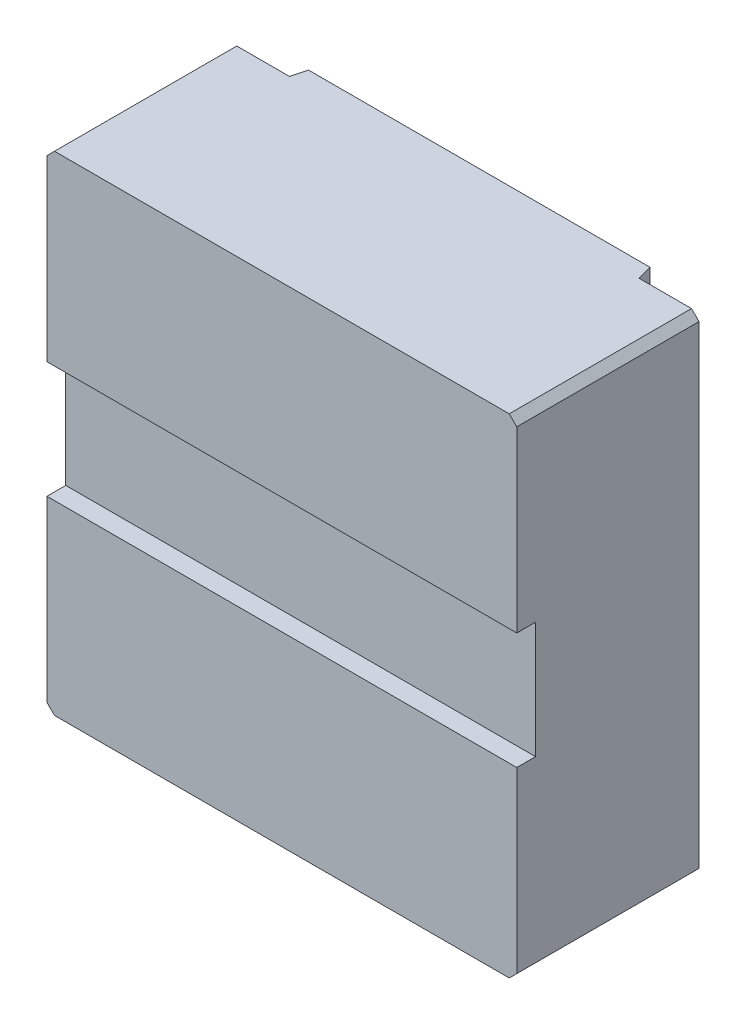
ISO-10303-21;
HEADER;
FILE_DESCRIPTION(('STEP AP214'),'2;1');
FILE_NAME('part.step','',(''),(''),'','','');
FILE_SCHEMA(('AUTOMOTIVE_DESIGN { 1 0 10303 214 1 1 1 1 }'));
ENDSEC;
DATA;
#1=APPLICATION_CONTEXT('core data for automotive mechanical design processes');
#2=APPLICATION_PROTOCOL_DEFINITION('international standard','automotive_design',2000,#1);
#3=PRODUCT_CONTEXT('',#1,'mechanical');
#4=PRODUCT('Part','Part','',(#3));
#5=PRODUCT_RELATED_PRODUCT_CATEGORY('part','',(#4));
#6=PRODUCT_DEFINITION_FORMATION('','',#4);
#7=PRODUCT_DEFINITION_CONTEXT('part definition',#1,'design');
#8=PRODUCT_DEFINITION('design','',#6,#7);
#9=PRODUCT_DEFINITION_SHAPE('','',#8);
#10=(LENGTH_UNIT() NAMED_UNIT(*) SI_UNIT(.MILLI.,.METRE.));
#11=(NAMED_UNIT(*) PLANE_ANGLE_UNIT() SI_UNIT($,.RADIAN.));
#12=(NAMED_UNIT(*) SI_UNIT($,.STERADIAN.) SOLID_ANGLE_UNIT());
#13=UNCERTAINTY_MEASURE_WITH_UNIT(LENGTH_MEASURE(1.E-05),#10,'distance_accuracy_value','');
#14=(GEOMETRIC_REPRESENTATION_CONTEXT(3) GLOBAL_UNCERTAINTY_ASSIGNED_CONTEXT((#13)) GLOBAL_UNIT_ASSIGNED_CONTEXT((#10,
#11,#12)) REPRESENTATION_CONTEXT('',''));
#15=CARTESIAN_POINT('',(0.,0.,0.));
#16=DIRECTION('',(0.,0.,1.));
#17=DIRECTION('',(1.,0.,0.));
#18=AXIS2_PLACEMENT_3D('',#15,#16,#17);
#19=CARTESIAN_POINT('',(-6.25,-6.5,-5.25));
#20=DIRECTION('',(0.,0.,1.));
#21=DIRECTION('',(1.,0.,0.));
#22=AXIS2_PLACEMENT_3D('',#19,#20,#21);
#23=PLANE('',#22);
#24=DIRECTION('',(-1.,0.,0.));
#25=VECTOR('',#24,1.);
#26=CARTESIAN_POINT('',(6.25,6.5,-5.25));
#27=LINE('',#26,#25);
#28=CARTESIAN_POINT('',(4.542820323028,6.5,-5.25));
#29=VERTEX_POINT('',#28);
#30=CARTESIAN_POINT('',(-4.542820323028,6.5,-5.25));
#31=VERTEX_POINT('',#30);
#32=EDGE_CURVE('E11',#29,#31,#27,.T.);
#33=ORIENTED_EDGE('',*,*,#32,.F.);
#34=DIRECTION('',(0.,1.,0.));
#35=VECTOR('',#34,1.);
#36=CARTESIAN_POINT('',(4.542820323028,-18.78330375626,-5.25));
#37=LINE('',#36,#35);
#38=CARTESIAN_POINT('',(4.542820323028,-6.5,-5.25));
#39=VERTEX_POINT('',#38);
#40=EDGE_CURVE('E23',#39,#29,#37,.T.);
#41=ORIENTED_EDGE('',*,*,#40,.F.);
#42=DIRECTION('',(1.,0.,0.));
#43=VECTOR('',#42,1.);
#44=CARTESIAN_POINT('',(-6.25,-6.5,-5.25));
#45=LINE('',#44,#43);
#46=CARTESIAN_POINT('',(-4.542820323028,-6.5,-5.25));
#47=VERTEX_POINT('',#46);
#48=EDGE_CURVE('E257',#47,#39,#45,.T.);
#49=ORIENTED_EDGE('',*,*,#48,.F.);
#50=DIRECTION('',(0.,-1.,0.));
#51=VECTOR('',#50,1.);
#52=CARTESIAN_POINT('',(-4.542820323028,-6.5,-5.25));
#53=LINE('',#52,#51);
#54=EDGE_CURVE('E36',#31,#47,#53,.T.);
#55=ORIENTED_EDGE('',*,*,#54,.F.);
#56=EDGE_LOOP('',(#33,#41,#49,#55));
#57=FACE_BOUND('',#56,.T.);
#58=ADVANCED_FACE('F16',(#57),#23,.F.);
#59=CARTESIAN_POINT('',(-6.25,-6.3,-5.25));
#60=DIRECTION('',(0.707106781186548,0.707106781186548,0.));
#61=DIRECTION('',(-0.707106781186548,0.707106781186548,0.));
#62=AXIS2_PLACEMENT_3D('',#59,#60,#61);
#63=PLANE('',#62);
#64=DIRECTION('',(0.707106781186548,-0.707106781186548,0.));
#65=VECTOR('',#64,1.);
#66=CARTESIAN_POINT('',(0.791651878131,-13.34165187813,-4.85));
#67=LINE('',#66,#65);
#68=CARTESIAN_POINT('',(-6.25,-6.3,-4.85));
#69=VERTEX_POINT('',#68);
#70=CARTESIAN_POINT('',(-6.05,-6.5,-4.85));
#71=VERTEX_POINT('',#70);
#72=EDGE_CURVE('E254',#69,#71,#67,.T.);
#73=ORIENTED_EDGE('',*,*,#72,.T.);
#74=DIRECTION('',(0.,0.,-1.));
#75=VECTOR('',#74,1.);
#76=CARTESIAN_POINT('',(-6.05,-6.5,-5.25));
#77=LINE('',#76,#75);
#78=CARTESIAN_POINT('',(-6.05,-6.5,0.));
#79=VERTEX_POINT('',#78);
#80=EDGE_CURVE('E134',#79,#71,#77,.T.);
#81=ORIENTED_EDGE('',*,*,#80,.F.);
#82=DIRECTION('',(-0.707106781186548,0.707106781186548,0.));
#83=VECTOR('',#82,1.);
#84=CARTESIAN_POINT('',(-6.15,-6.4,0.));
#85=LINE('',#84,#83);
#86=CARTESIAN_POINT('',(-6.25,-6.3,0.));
#87=VERTEX_POINT('',#86);
#88=EDGE_CURVE('E250',#79,#87,#85,.T.);
#89=ORIENTED_EDGE('',*,*,#88,.T.);
#90=DIRECTION('',(0.,0.,1.));
#91=VECTOR('',#90,1.);
#92=CARTESIAN_POINT('',(-6.25,-6.3,-5.25));
#93=LINE('',#92,#91);
#94=EDGE_CURVE('E248',#69,#87,#93,.T.);
#95=ORIENTED_EDGE('',*,*,#94,.F.);
#96=EDGE_LOOP('',(#73,#81,#89,#95));
#97=FACE_BOUND('',#96,.T.);
#98=ADVANCED_FACE('F300',(#97),#63,.F.);
#99=CARTESIAN_POINT('',(6.25,6.5,-5.25));
#100=DIRECTION('',(0.,1.,0.));
#101=DIRECTION('',(-1.,0.,0.));
#102=AXIS2_PLACEMENT_3D('',#99,#100,#101);
#103=PLANE('',#102);
#104=DIRECTION('',(-1.,0.,0.));
#105=VECTOR('',#104,1.);
#106=CARTESIAN_POINT('',(6.25,6.5,0.));
#107=LINE('',#106,#105);
#108=CARTESIAN_POINT('',(6.05,6.5,0.));
#109=VERTEX_POINT('',#108);
#110=CARTESIAN_POINT('',(-6.05,6.5,0.));
#111=VERTEX_POINT('',#110);
#112=EDGE_CURVE('E246',#109,#111,#107,.T.);
#113=ORIENTED_EDGE('',*,*,#112,.F.);
#114=DIRECTION('',(0.,0.,-1.));
#115=VECTOR('',#114,1.);
#116=CARTESIAN_POINT('',(6.05,6.5,-5.25));
#117=LINE('',#116,#115);
#118=CARTESIAN_POINT('',(6.05,6.5,-4.85));
#119=VERTEX_POINT('',#118);
#120=EDGE_CURVE('E244',#109,#119,#117,.T.);
#121=ORIENTED_EDGE('',*,*,#120,.T.);
#122=DIRECTION('',(-1.,0.,0.));
#123=VECTOR('',#122,1.);
#124=CARTESIAN_POINT('',(6.25,6.5,-4.85));
#125=LINE('',#124,#123);
#126=CARTESIAN_POINT('',(4.65,6.5,-4.85));
#127=VERTEX_POINT('',#126);
#128=EDGE_CURVE('E242',#119,#127,#125,.T.);
#129=ORIENTED_EDGE('',*,*,#128,.T.);
#130=DIRECTION('',(-0.258819045102985,0.,-0.965925826288944));
#131=VECTOR('',#130,1.);
#132=CARTESIAN_POINT('',(4.657179676972,6.5,-4.823205080757));
#133=LINE('',#132,#131);
#134=EDGE_CURVE('E239',#127,#29,#133,.T.);
#135=ORIENTED_EDGE('',*,*,#134,.T.);
#136=ORIENTED_EDGE('',*,*,#32,.T.);
#137=DIRECTION('',(0.258819045102985,0.,-0.965925826288944));
#138=VECTOR('',#137,1.);
#139=CARTESIAN_POINT('',(-3.819838450625,6.5,-7.948205080757));
#140=LINE('',#139,#138);
#141=CARTESIAN_POINT('',(-4.65,6.5,-4.85));
#142=VERTEX_POINT('',#141);
#143=EDGE_CURVE('E237',#142,#31,#140,.T.);
#144=ORIENTED_EDGE('',*,*,#143,.F.);
#145=DIRECTION('',(1.,0.,0.));
#146=VECTOR('',#145,1.);
#147=CARTESIAN_POINT('',(6.25,6.5,-4.85));
#148=LINE('',#147,#146);
#149=CARTESIAN_POINT('',(-6.05,6.5,-4.85));
#150=VERTEX_POINT('',#149);
#151=EDGE_CURVE('E152',#150,#142,#148,.T.);
#152=ORIENTED_EDGE('',*,*,#151,.F.);
#153=DIRECTION('',(0.,0.,1.));
#154=VECTOR('',#153,1.);
#155=CARTESIAN_POINT('',(-6.05,6.5,-5.25));
#156=LINE('',#155,#154);
#157=EDGE_CURVE('E233',#150,#111,#156,.T.);
#158=ORIENTED_EDGE('',*,*,#157,.T.);
#159=EDGE_LOOP('',(#113,#121,#129,#135,#136,#144,#152,#158));
#160=FACE_BOUND('',#159,.T.);
#161=ADVANCED_FACE('F302',(#160),#103,.T.);
#162=CARTESIAN_POINT('',(4.65,-18.78330375626,-4.85));
#163=DIRECTION('',(0.,0.,1.));
#164=DIRECTION('',(1.,0.,0.));
#165=AXIS2_PLACEMENT_3D('',#162,#163,#164);
#166=PLANE('',#165);
#167=DIRECTION('',(0.,-1.,0.));
#168=VECTOR('',#167,1.);
#169=CARTESIAN_POINT('',(6.25,-6.5,-4.85));
#170=LINE('',#169,#168);
#171=CARTESIAN_POINT('',(6.25,6.3,-4.85));
#172=VERTEX_POINT('',#171);
#173=CARTESIAN_POINT('',(6.25,-6.3,-4.85));
#174=VERTEX_POINT('',#173);
#175=EDGE_CURVE('E230',#172,#174,#170,.T.);
#176=ORIENTED_EDGE('',*,*,#175,.T.);
#177=DIRECTION('',(0.707106781186548,0.707106781186548,0.));
#178=VECTOR('',#177,1.);
#179=CARTESIAN_POINT('',(6.05,-6.5,-4.85));
#180=LINE('',#179,#178);
#181=CARTESIAN_POINT('',(6.05,-6.5,-4.85));
#182=VERTEX_POINT('',#181);
#183=EDGE_CURVE('E228',#182,#174,#180,.T.);
#184=ORIENTED_EDGE('',*,*,#183,.F.);
#185=DIRECTION('',(-1.,0.,0.));
#186=VECTOR('',#185,1.);
#187=CARTESIAN_POINT('',(-6.25,-6.5,-4.85));
#188=LINE('',#187,#186);
#189=CARTESIAN_POINT('',(4.65,-6.5,-4.85));
#190=VERTEX_POINT('',#189);
#191=EDGE_CURVE('E225',#182,#190,#188,.T.);
#192=ORIENTED_EDGE('',*,*,#191,.T.);
#193=DIRECTION('',(0.,1.,0.));
#194=VECTOR('',#193,1.);
#195=CARTESIAN_POINT('',(4.65,-18.78330375626,-4.85));
#196=LINE('',#195,#194);
#197=EDGE_CURVE('E222',#190,#127,#196,.T.);
#198=ORIENTED_EDGE('',*,*,#197,.T.);
#199=ORIENTED_EDGE('',*,*,#128,.F.);
#200=DIRECTION('',(-0.707106781186548,0.707106781186548,0.));
#201=VECTOR('',#200,1.);
#202=CARTESIAN_POINT('',(6.25,6.3,-4.85));
#203=LINE('',#202,#201);
#204=EDGE_CURVE('E219',#172,#119,#203,.T.);
#205=ORIENTED_EDGE('',*,*,#204,.F.);
#206=EDGE_LOOP('',(#176,#184,#192,#198,#199,#205));
#207=FACE_BOUND('',#206,.T.);
#208=ADVANCED_FACE('F263',(#207),#166,.F.);
#209=CARTESIAN_POINT('',(4.542820323028,-18.78330375626,-5.25));
#210=DIRECTION('',(-0.965925826288944,0.,0.258819045102985));
#211=DIRECTION('',(0.258819045102985,0.,0.965925826288944));
#212=AXIS2_PLACEMENT_3D('',#209,#210,#211);
#213=PLANE('',#212);
#214=DIRECTION('',(-0.258819045102985,0.,-0.965925826288944));
#215=VECTOR('',#214,1.);
#216=CARTESIAN_POINT('',(3.819838450625,-6.5,-7.948205080757));
#217=LINE('',#216,#215);
#218=EDGE_CURVE('E217',#190,#39,#217,.T.);
#219=ORIENTED_EDGE('',*,*,#218,.T.);
#220=ORIENTED_EDGE('',*,*,#40,.T.);
#221=ORIENTED_EDGE('',*,*,#134,.F.);
#222=ORIENTED_EDGE('',*,*,#197,.F.);
#223=EDGE_LOOP('',(#219,#220,#221,#222));
#224=FACE_BOUND('',#223,.T.);
#225=ADVANCED_FACE('F259',(#224),#213,.F.);
#226=CARTESIAN_POINT('',(-6.25,6.5,-5.25));
#227=DIRECTION('',(-1.,0.,0.));
#228=DIRECTION('',(0.,0.,1.));
#229=AXIS2_PLACEMENT_3D('',#226,#227,#228);
#230=PLANE('',#229);
#231=DIRECTION('',(0.,-1.,0.));
#232=VECTOR('',#231,1.);
#233=CARTESIAN_POINT('',(-6.25,6.5,0.));
#234=LINE('',#233,#232);
#235=CARTESIAN_POINT('',(-6.25,6.3,0.));
#236=VERTEX_POINT('',#235);
#237=CARTESIAN_POINT('',(-6.25,1.55,0.));
#238=VERTEX_POINT('',#237);
#239=EDGE_CURVE('E215',#236,#238,#234,.T.);
#240=ORIENTED_EDGE('',*,*,#239,.F.);
#241=DIRECTION('',(0.,0.,-1.));
#242=VECTOR('',#241,1.);
#243=CARTESIAN_POINT('',(-6.25,6.3,-5.25));
#244=LINE('',#243,#242);
#245=CARTESIAN_POINT('',(-6.25,6.3,-4.85));
#246=VERTEX_POINT('',#245);
#247=EDGE_CURVE('E213',#236,#246,#244,.T.);
#248=ORIENTED_EDGE('',*,*,#247,.T.);
#249=DIRECTION('',(0.,1.,0.));
#250=VECTOR('',#249,1.);
#251=CARTESIAN_POINT('',(-6.25,-18.78330375626,-4.85));
#252=LINE('',#251,#250);
#253=EDGE_CURVE('E211',#69,#246,#252,.T.);
#254=ORIENTED_EDGE('',*,*,#253,.F.);
#255=ORIENTED_EDGE('',*,*,#94,.T.);
#256=DIRECTION('',(0.,-1.,0.));
#257=VECTOR('',#256,1.);
#258=CARTESIAN_POINT('',(-6.25,6.5,0.));
#259=LINE('',#258,#257);
#260=CARTESIAN_POINT('',(-6.25,-1.55,0.));
#261=VERTEX_POINT('',#260);
#262=EDGE_CURVE('E208',#261,#87,#259,.T.);
#263=ORIENTED_EDGE('',*,*,#262,.F.);
#264=DIRECTION('',(0.,0.,-1.));
#265=VECTOR('',#264,1.);
#266=CARTESIAN_POINT('',(-6.25,-1.55,0.));
#267=LINE('',#266,#265);
#268=CARTESIAN_POINT('',(-6.25,-1.55,-0.5));
#269=VERTEX_POINT('',#268);
#270=EDGE_CURVE('E206',#261,#269,#267,.T.);
#271=ORIENTED_EDGE('',*,*,#270,.T.);
#272=DIRECTION('',(0.,1.,0.));
#273=VECTOR('',#272,1.);
#274=CARTESIAN_POINT('',(-6.25,-1.55,-0.5));
#275=LINE('',#274,#273);
#276=CARTESIAN_POINT('',(-6.25,1.55,-0.5));
#277=VERTEX_POINT('',#276);
#278=EDGE_CURVE('E204',#269,#277,#275,.T.);
#279=ORIENTED_EDGE('',*,*,#278,.T.);
#280=DIRECTION('',(0.,0.,-1.));
#281=VECTOR('',#280,1.);
#282=CARTESIAN_POINT('',(-6.25,1.55,0.));
#283=LINE('',#282,#281);
#284=EDGE_CURVE('E201',#238,#277,#283,.T.);
#285=ORIENTED_EDGE('',*,*,#284,.F.);
#286=EDGE_LOOP('',(#240,#248,#254,#255,#263,#271,#279,#285));
#287=FACE_BOUND('',#286,.T.);
#288=ADVANCED_FACE('F286',(#287),#230,.T.);
#289=CARTESIAN_POINT('',(-6.25,-6.5,0.));
#290=DIRECTION('',(0.,0.,1.));
#291=DIRECTION('',(1.,0.,0.));
#292=AXIS2_PLACEMENT_3D('',#289,#290,#291);
#293=PLANE('',#292);
#294=DIRECTION('',(1.,0.,0.));
#295=VECTOR('',#294,1.);
#296=CARTESIAN_POINT('',(-6.25,-6.5,0.));
#297=LINE('',#296,#295);
#298=CARTESIAN_POINT('',(6.05,-6.5,0.));
#299=VERTEX_POINT('',#298);
#300=EDGE_CURVE('E199',#79,#299,#297,.T.);
#301=ORIENTED_EDGE('',*,*,#300,.T.);
#302=DIRECTION('',(-0.707106781186548,-0.707106781186548,0.));
#303=VECTOR('',#302,1.);
#304=CARTESIAN_POINT('',(-0.09999999999997,-12.65,0.));
#305=LINE('',#304,#303);
#306=CARTESIAN_POINT('',(6.25,-6.3,0.));
#307=VERTEX_POINT('',#306);
#308=EDGE_CURVE('E196',#307,#299,#305,.T.);
#309=ORIENTED_EDGE('',*,*,#308,.F.);
#310=DIRECTION('',(0.,1.,0.));
#311=VECTOR('',#310,1.);
#312=CARTESIAN_POINT('',(6.25,-6.5,0.));
#313=LINE('',#312,#311);
#314=CARTESIAN_POINT('',(6.25,-1.55,0.));
#315=VERTEX_POINT('',#314);
#316=EDGE_CURVE('E194',#307,#315,#313,.T.);
#317=ORIENTED_EDGE('',*,*,#316,.T.);
#318=DIRECTION('',(-1.,0.,0.));
#319=VECTOR('',#318,1.);
#320=CARTESIAN_POINT('',(6.25,-1.55,0.));
#321=LINE('',#320,#319);
#322=EDGE_CURVE('E191',#315,#261,#321,.T.);
#323=ORIENTED_EDGE('',*,*,#322,.T.);
#324=ORIENTED_EDGE('',*,*,#262,.T.);
#325=ORIENTED_EDGE('',*,*,#88,.F.);
#326=EDGE_LOOP('',(#301,#309,#317,#323,#324,#325));
#327=FACE_BOUND('',#326,.T.);
#328=ADVANCED_FACE('F270',(#327),#293,.T.);
#329=CARTESIAN_POINT('',(-6.25,-6.5,0.));
#330=DIRECTION('',(0.,0.,1.));
#331=DIRECTION('',(1.,0.,0.));
#332=AXIS2_PLACEMENT_3D('',#329,#330,#331);
#333=PLANE('',#332);
#334=DIRECTION('',(0.,1.,0.));
#335=VECTOR('',#334,1.);
#336=CARTESIAN_POINT('',(6.25,-6.5,0.));
#337=LINE('',#336,#335);
#338=CARTESIAN_POINT('',(6.25,1.55,0.));
#339=VERTEX_POINT('',#338);
#340=CARTESIAN_POINT('',(6.25,6.3,0.));
#341=VERTEX_POINT('',#340);
#342=EDGE_CURVE('E189',#339,#341,#337,.T.);
#343=ORIENTED_EDGE('',*,*,#342,.T.);
#344=DIRECTION('',(0.707106781186548,-0.707106781186548,0.));
#345=VECTOR('',#344,1.);
#346=CARTESIAN_POINT('',(6.4,6.15,0.));
#347=LINE('',#346,#345);
#348=EDGE_CURVE('E186',#109,#341,#347,.T.);
#349=ORIENTED_EDGE('',*,*,#348,.F.);
#350=ORIENTED_EDGE('',*,*,#112,.T.);
#351=DIRECTION('',(0.707106781186548,0.707106781186548,0.));
#352=VECTOR('',#351,1.);
#353=CARTESIAN_POINT('',(-12.65,-0.1,0.));
#354=LINE('',#353,#352);
#355=EDGE_CURVE('E183',#236,#111,#354,.T.);
#356=ORIENTED_EDGE('',*,*,#355,.F.);
#357=ORIENTED_EDGE('',*,*,#239,.T.);
#358=DIRECTION('',(-1.,0.,0.));
#359=VECTOR('',#358,1.);
#360=CARTESIAN_POINT('',(6.25,1.55,0.));
#361=LINE('',#360,#359);
#362=EDGE_CURVE('E180',#339,#238,#361,.T.);
#363=ORIENTED_EDGE('',*,*,#362,.F.);
#364=EDGE_LOOP('',(#343,#349,#350,#356,#357,#363));
#365=FACE_BOUND('',#364,.T.);
#366=ADVANCED_FACE('F291',(#365),#333,.T.);
#367=CARTESIAN_POINT('',(6.25,-6.5,-5.25));
#368=DIRECTION('',(1.,0.,0.));
#369=DIRECTION('',(0.,0.,-1.));
#370=AXIS2_PLACEMENT_3D('',#367,#368,#369);
#371=PLANE('',#370);
#372=ORIENTED_EDGE('',*,*,#316,.F.);
#373=DIRECTION('',(0.,0.,-1.));
#374=VECTOR('',#373,1.);
#375=CARTESIAN_POINT('',(6.25,-6.3,-5.25));
#376=LINE('',#375,#374);
#377=EDGE_CURVE('E177',#307,#174,#376,.T.);
#378=ORIENTED_EDGE('',*,*,#377,.T.);
#379=ORIENTED_EDGE('',*,*,#175,.F.);
#380=DIRECTION('',(0.,0.,1.));
#381=VECTOR('',#380,1.);
#382=CARTESIAN_POINT('',(6.25,6.3,-5.25));
#383=LINE('',#382,#381);
#384=EDGE_CURVE('E174',#172,#341,#383,.T.);
#385=ORIENTED_EDGE('',*,*,#384,.T.);
#386=ORIENTED_EDGE('',*,*,#342,.F.);
#387=DIRECTION('',(0.,0.,1.));
#388=VECTOR('',#387,1.);
#389=CARTESIAN_POINT('',(6.25,1.55,-0.5));
#390=LINE('',#389,#388);
#391=CARTESIAN_POINT('',(6.25,1.55,-0.5));
#392=VERTEX_POINT('',#391);
#393=EDGE_CURVE('E171',#392,#339,#390,.T.);
#394=ORIENTED_EDGE('',*,*,#393,.F.);
#395=DIRECTION('',(0.,1.,0.));
#396=VECTOR('',#395,1.);
#397=CARTESIAN_POINT('',(6.25,-1.55,-0.5));
#398=LINE('',#397,#396);
#399=CARTESIAN_POINT('',(6.25,-1.55,-0.5));
#400=VERTEX_POINT('',#399);
#401=EDGE_CURVE('E168',#400,#392,#398,.T.);
#402=ORIENTED_EDGE('',*,*,#401,.F.);
#403=DIRECTION('',(0.,0.,1.));
#404=VECTOR('',#403,1.);
#405=CARTESIAN_POINT('',(6.25,-1.55,-0.5));
#406=LINE('',#405,#404);
#407=EDGE_CURVE('E165',#400,#315,#406,.T.);
#408=ORIENTED_EDGE('',*,*,#407,.T.);
#409=EDGE_LOOP('',(#372,#378,#379,#385,#386,#394,#402,#408));
#410=FACE_BOUND('',#409,.T.);
#411=ADVANCED_FACE('F273',(#410),#371,.T.);
#412=CARTESIAN_POINT('',(6.25,6.3,-5.25));
#413=DIRECTION('',(-0.707106781186548,-0.707106781186548,0.));
#414=DIRECTION('',(0.707106781186548,-0.707106781186548,0.));
#415=AXIS2_PLACEMENT_3D('',#412,#413,#414);
#416=PLANE('',#415);
#417=ORIENTED_EDGE('',*,*,#204,.T.);
#418=ORIENTED_EDGE('',*,*,#120,.F.);
#419=ORIENTED_EDGE('',*,*,#348,.T.);
#420=ORIENTED_EDGE('',*,*,#384,.F.);
#421=EDGE_LOOP('',(#417,#418,#419,#420));
#422=FACE_BOUND('',#421,.T.);
#423=ADVANCED_FACE('F323',(#422),#416,.F.);
#424=CARTESIAN_POINT('',(6.05,-6.5,-5.25));
#425=DIRECTION('',(-0.707106781186548,0.707106781186548,0.));
#426=DIRECTION('',(-0.707106781186548,-0.707106781186548,0.));
#427=AXIS2_PLACEMENT_3D('',#424,#425,#426);
#428=PLANE('',#427);
#429=ORIENTED_EDGE('',*,*,#183,.T.);
#430=ORIENTED_EDGE('',*,*,#377,.F.);
#431=ORIENTED_EDGE('',*,*,#308,.T.);
#432=DIRECTION('',(0.,0.,1.));
#433=VECTOR('',#432,1.);
#434=CARTESIAN_POINT('',(6.05,-6.5,-5.25));
#435=LINE('',#434,#433);
#436=EDGE_CURVE('E139',#182,#299,#435,.T.);
#437=ORIENTED_EDGE('',*,*,#436,.F.);
#438=EDGE_LOOP('',(#429,#430,#431,#437));
#439=FACE_BOUND('',#438,.T.);
#440=ADVANCED_FACE('F266',(#439),#428,.F.);
#441=CARTESIAN_POINT('',(-6.25,-6.5,-5.25));
#442=DIRECTION('',(0.,-1.,0.));
#443=DIRECTION('',(1.,0.,0.));
#444=AXIS2_PLACEMENT_3D('',#441,#442,#443);
#445=PLANE('',#444);
#446=ORIENTED_EDGE('',*,*,#191,.F.);
#447=ORIENTED_EDGE('',*,*,#436,.T.);
#448=ORIENTED_EDGE('',*,*,#300,.F.);
#449=ORIENTED_EDGE('',*,*,#80,.T.);
#450=DIRECTION('',(1.,0.,0.));
#451=VECTOR('',#450,1.);
#452=CARTESIAN_POINT('',(-6.25,-6.5,-4.85));
#453=LINE('',#452,#451);
#454=CARTESIAN_POINT('',(-4.65,-6.5,-4.85));
#455=VERTEX_POINT('',#454);
#456=EDGE_CURVE('E128',#71,#455,#453,.T.);
#457=ORIENTED_EDGE('',*,*,#456,.T.);
#458=DIRECTION('',(0.258819045102985,0.,-0.965925826288944));
#459=VECTOR('',#458,1.);
#460=CARTESIAN_POINT('',(-4.657179676972,-6.5,-4.823205080757));
#461=LINE('',#460,#459);
#462=EDGE_CURVE('E131',#455,#47,#461,.T.);
#463=ORIENTED_EDGE('',*,*,#462,.T.);
#464=ORIENTED_EDGE('',*,*,#48,.T.);
#465=ORIENTED_EDGE('',*,*,#218,.F.);
#466=EDGE_LOOP('',(#446,#447,#448,#449,#457,#463,#464,#465));
#467=FACE_BOUND('',#466,.T.);
#468=ADVANCED_FACE('F130',(#467),#445,.T.);
#469=CARTESIAN_POINT('',(-6.25,-1.55,-0.5));
#470=DIRECTION('',(0.,-1.,0.));
#471=DIRECTION('',(0.,0.,-1.));
#472=AXIS2_PLACEMENT_3D('',#469,#470,#471);
#473=PLANE('',#472);
#474=ORIENTED_EDGE('',*,*,#270,.F.);
#475=ORIENTED_EDGE('',*,*,#322,.F.);
#476=ORIENTED_EDGE('',*,*,#407,.F.);
#477=DIRECTION('',(1.,0.,0.));
#478=VECTOR('',#477,1.);
#479=CARTESIAN_POINT('',(-6.25,-1.55,-0.5));
#480=LINE('',#479,#478);
#481=EDGE_CURVE('E146',#269,#400,#480,.T.);
#482=ORIENTED_EDGE('',*,*,#481,.F.);
#483=EDGE_LOOP('',(#474,#475,#476,#482));
#484=FACE_BOUND('',#483,.T.);
#485=ADVANCED_FACE('F279',(#484),#473,.F.);
#486=CARTESIAN_POINT('',(-6.25,-1.55,-0.5));
#487=DIRECTION('',(0.,0.,1.));
#488=DIRECTION('',(1.,0.,0.));
#489=AXIS2_PLACEMENT_3D('',#486,#487,#488);
#490=PLANE('',#489);
#491=DIRECTION('',(1.,0.,0.));
#492=VECTOR('',#491,1.);
#493=CARTESIAN_POINT('',(-6.25,1.55,-0.5));
#494=LINE('',#493,#492);
#495=EDGE_CURVE('E156',#277,#392,#494,.T.);
#496=ORIENTED_EDGE('',*,*,#495,.F.);
#497=ORIENTED_EDGE('',*,*,#278,.F.);
#498=ORIENTED_EDGE('',*,*,#481,.T.);
#499=ORIENTED_EDGE('',*,*,#401,.T.);
#500=EDGE_LOOP('',(#496,#497,#498,#499));
#501=FACE_BOUND('',#500,.T.);
#502=ADVANCED_FACE('F283',(#501),#490,.T.);
#503=CARTESIAN_POINT('',(-6.25,1.55,-0.5));
#504=DIRECTION('',(0.,-1.,0.));
#505=DIRECTION('',(0.,0.,-1.));
#506=AXIS2_PLACEMENT_3D('',#503,#504,#505);
#507=PLANE('',#506);
#508=ORIENTED_EDGE('',*,*,#284,.T.);
#509=ORIENTED_EDGE('',*,*,#495,.T.);
#510=ORIENTED_EDGE('',*,*,#393,.T.);
#511=ORIENTED_EDGE('',*,*,#362,.T.);
#512=EDGE_LOOP('',(#508,#509,#510,#511));
#513=FACE_BOUND('',#512,.T.);
#514=ADVANCED_FACE('F288',(#513),#507,.T.);
#515=CARTESIAN_POINT('',(-4.65,-18.78330375626,-4.85));
#516=DIRECTION('',(0.,0.,-1.));
#517=DIRECTION('',(-1.,0.,0.));
#518=AXIS2_PLACEMENT_3D('',#515,#516,#517);
#519=PLANE('',#518);
#520=ORIENTED_EDGE('',*,*,#253,.T.);
#521=DIRECTION('',(-0.707106781186548,-0.707106781186548,0.));
#522=VECTOR('',#521,1.);
#523=CARTESIAN_POINT('',(-17.99165187813,-5.441651878131,-4.85));
#524=LINE('',#523,#522);
#525=EDGE_CURVE('E153',#150,#246,#524,.T.);
#526=ORIENTED_EDGE('',*,*,#525,.F.);
#527=ORIENTED_EDGE('',*,*,#151,.T.);
#528=DIRECTION('',(0.,1.,0.));
#529=VECTOR('',#528,1.);
#530=CARTESIAN_POINT('',(-4.65,-18.78330375626,-4.85));
#531=LINE('',#530,#529);
#532=EDGE_CURVE('E145',#455,#142,#531,.T.);
#533=ORIENTED_EDGE('',*,*,#532,.F.);
#534=ORIENTED_EDGE('',*,*,#456,.F.);
#535=ORIENTED_EDGE('',*,*,#72,.F.);
#536=EDGE_LOOP('',(#520,#526,#527,#533,#534,#535));
#537=FACE_BOUND('',#536,.T.);
#538=ADVANCED_FACE('F150',(#537),#519,.T.);
#539=CARTESIAN_POINT('',(-4.542820323028,-18.78330375626,-5.25));
#540=DIRECTION('',(-0.965925826288944,0.,-0.258819045102985));
#541=DIRECTION('',(-0.258819045102985,0.,0.965925826288944));
#542=AXIS2_PLACEMENT_3D('',#539,#540,#541);
#543=PLANE('',#542);
#544=ORIENTED_EDGE('',*,*,#532,.T.);
#545=ORIENTED_EDGE('',*,*,#143,.T.);
#546=ORIENTED_EDGE('',*,*,#54,.T.);
#547=ORIENTED_EDGE('',*,*,#462,.F.);
#548=EDGE_LOOP('',(#544,#545,#546,#547));
#549=FACE_BOUND('',#548,.T.);
#550=ADVANCED_FACE('F143',(#549),#543,.T.);
#551=CARTESIAN_POINT('',(-6.05,6.5,-5.25));
#552=DIRECTION('',(0.707106781186548,-0.707106781186548,0.));
#553=DIRECTION('',(0.707106781186548,0.707106781186548,0.));
#554=AXIS2_PLACEMENT_3D('',#551,#552,#553);
#555=PLANE('',#554);
#556=ORIENTED_EDGE('',*,*,#525,.T.);
#557=ORIENTED_EDGE('',*,*,#247,.F.);
#558=ORIENTED_EDGE('',*,*,#355,.T.);
#559=ORIENTED_EDGE('',*,*,#157,.F.);
#560=EDGE_LOOP('',(#556,#557,#558,#559));
#561=FACE_BOUND('',#560,.T.);
#562=ADVANCED_FACE('F297',(#561),#555,.F.);
#563=CLOSED_SHELL('',(#58,#98,#161,#208,#225,#288,#328,#366,#411,#423,#440,#468,#485,#502,#514,
#538,#550,#562));
#564=MANIFOLD_SOLID_BREP('B1',#563);
#565=ADVANCED_BREP_SHAPE_REPRESENTATION('',(#18,#564),#14);
#566=SHAPE_DEFINITION_REPRESENTATION(#9,#565);
ENDSEC;
END-ISO-10303-21;
